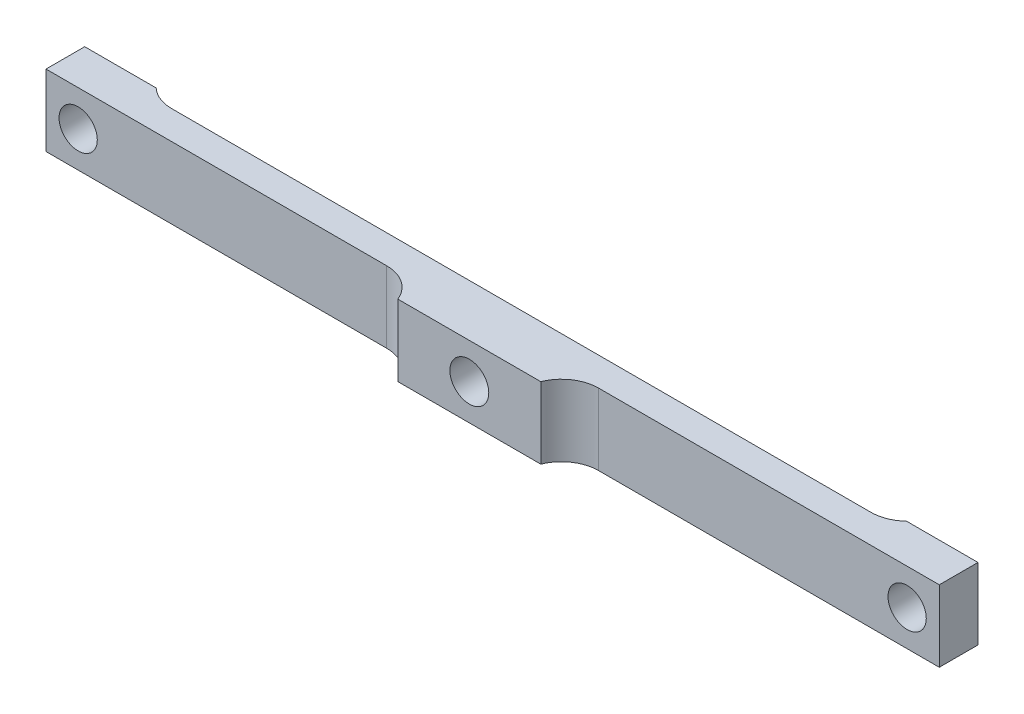
ISO-10303-21;
HEADER;
FILE_DESCRIPTION(('STEP AP214'),'2;1');
FILE_NAME('part.step','',(''),(''),'','','');
FILE_SCHEMA(('AUTOMOTIVE_DESIGN { 1 0 10303 214 1 1 1 1 }'));
ENDSEC;
DATA;
#1=APPLICATION_CONTEXT('core data for automotive mechanical design processes');
#2=APPLICATION_PROTOCOL_DEFINITION('international standard','automotive_design',2000,#1);
#3=PRODUCT_CONTEXT('',#1,'mechanical');
#4=PRODUCT('Part','Part','',(#3));
#5=PRODUCT_RELATED_PRODUCT_CATEGORY('part','',(#4));
#6=PRODUCT_DEFINITION_FORMATION('','',#4);
#7=PRODUCT_DEFINITION_CONTEXT('part definition',#1,'design');
#8=PRODUCT_DEFINITION('design','',#6,#7);
#9=PRODUCT_DEFINITION_SHAPE('','',#8);
#10=(LENGTH_UNIT() NAMED_UNIT(*) SI_UNIT(.MILLI.,.METRE.));
#11=(NAMED_UNIT(*) PLANE_ANGLE_UNIT() SI_UNIT($,.RADIAN.));
#12=(NAMED_UNIT(*) SI_UNIT($,.STERADIAN.) SOLID_ANGLE_UNIT());
#13=UNCERTAINTY_MEASURE_WITH_UNIT(LENGTH_MEASURE(1.E-05),#10,'distance_accuracy_value','');
#14=(GEOMETRIC_REPRESENTATION_CONTEXT(3) GLOBAL_UNCERTAINTY_ASSIGNED_CONTEXT((#13)) GLOBAL_UNIT_ASSIGNED_CONTEXT((#10,
#11,#12)) REPRESENTATION_CONTEXT('',''));
#15=CARTESIAN_POINT('',(0.,0.,0.));
#16=DIRECTION('',(0.,0.,1.));
#17=DIRECTION('',(1.,0.,0.));
#18=AXIS2_PLACEMENT_3D('',#15,#16,#17);
#19=CARTESIAN_POINT('',(39.6875,3.175,5.5118));
#20=DIRECTION('',(0.,0.,-1.));
#21=DIRECTION('',(-1.,0.,0.));
#22=AXIS2_PLACEMENT_3D('',#19,#20,#21);
#23=PLANE('',#22);
#24=DIRECTION('',(0.,-1.,0.));
#25=VECTOR('',#24,1.);
#26=CARTESIAN_POINT('',(-6.35,3.175,5.5118));
#27=LINE('',#26,#25);
#28=CARTESIAN_POINT('',(-6.35,3.175,5.5118));
#29=VERTEX_POINT('',#28);
#30=CARTESIAN_POINT('',(-6.35000000000002,-3.175,5.5118));
#31=VERTEX_POINT('',#30);
#32=EDGE_CURVE('E169',#29,#31,#27,.T.);
#33=ORIENTED_EDGE('',*,*,#32,.T.);
#34=DIRECTION('',(1.,0.,0.));
#35=VECTOR('',#34,1.);
#36=CARTESIAN_POINT('',(-39.6875,-3.175,5.5118));
#37=LINE('',#36,#35);
#38=CARTESIAN_POINT('',(6.35,-3.175,5.5118));
#39=VERTEX_POINT('',#38);
#40=EDGE_CURVE('E173',#31,#39,#37,.T.);
#41=ORIENTED_EDGE('',*,*,#40,.T.);
#42=DIRECTION('',(0.,-1.,0.));
#43=VECTOR('',#42,1.);
#44=CARTESIAN_POINT('',(6.35,3.175,5.5118));
#45=LINE('',#44,#43);
#46=CARTESIAN_POINT('',(6.34999999999999,3.175,5.5118));
#47=VERTEX_POINT('',#46);
#48=EDGE_CURVE('E171',#47,#39,#45,.T.);
#49=ORIENTED_EDGE('',*,*,#48,.F.);
#50=DIRECTION('',(-1.,0.,0.));
#51=VECTOR('',#50,1.);
#52=CARTESIAN_POINT('',(-39.6875,3.175,5.5118));
#53=LINE('',#52,#51);
#54=EDGE_CURVE('E159',#47,#29,#53,.T.);
#55=ORIENTED_EDGE('',*,*,#54,.T.);
#56=EDGE_LOOP('',(#33,#41,#49,#55));
#57=FACE_BOUND('',#56,.T.);
#58=CARTESIAN_POINT('',(0.,0.,5.5118));
#59=DIRECTION('',(0.,0.,1.));
#60=DIRECTION('',(1.,0.,0.));
#61=AXIS2_PLACEMENT_3D('',#58,#59,#60);
#62=CIRCLE('',#61,1.72719999999999);
#63=CARTESIAN_POINT('',(1.72719999999999,0.,5.5118));
#64=VERTEX_POINT('',#63);
#65=EDGE_CURVE('E316',#64,#64,#62,.T.);
#66=ORIENTED_EDGE('',*,*,#65,.F.);
#67=EDGE_LOOP('',(#66));
#68=FACE_BOUND('',#67,.T.);
#69=ADVANCED_FACE('F46',(#57,#68),#23,.F.);
#70=CARTESIAN_POINT('',(-39.6875,3.175,5.5118));
#71=DIRECTION('',(0.,-1.,0.));
#72=DIRECTION('',(0.,0.,-1.));
#73=AXIS2_PLACEMENT_3D('',#70,#71,#72);
#74=PLANE('',#73);
#75=DIRECTION('',(-1.,0.,0.));
#76=VECTOR('',#75,1.);
#77=CARTESIAN_POINT('',(-39.6875,3.175,3.43916));
#78=LINE('',#77,#76);
#79=CARTESIAN_POINT('',(-9.41461710339155,3.175,3.43916));
#80=VERTEX_POINT('',#79);
#81=CARTESIAN_POINT('',(-39.6875,3.175,3.43916));
#82=VERTEX_POINT('',#81);
#83=EDGE_CURVE('E161',#80,#82,#78,.T.);
#84=ORIENTED_EDGE('',*,*,#83,.F.);
#85=CARTESIAN_POINT('',(-9.41461710339155,3.175,6.74116));
#86=DIRECTION('',(0.,-1.,0.));
#87=DIRECTION('',(0.,0.,-1.));
#88=AXIS2_PLACEMENT_3D('',#85,#86,#87);
#89=CIRCLE('',#88,3.302);
#90=EDGE_CURVE('E75',#80,#29,#89,.T.);
#91=ORIENTED_EDGE('',*,*,#90,.T.);
#92=ORIENTED_EDGE('',*,*,#54,.F.);
#93=CARTESIAN_POINT('',(9.41461710339155,3.175,6.74116));
#94=DIRECTION('',(0.,-1.,0.));
#95=DIRECTION('',(0.,0.,-1.));
#96=AXIS2_PLACEMENT_3D('',#93,#94,#95);
#97=CIRCLE('',#96,3.302);
#98=CARTESIAN_POINT('',(9.41461710339155,3.175,3.43916));
#99=VERTEX_POINT('',#98);
#100=EDGE_CURVE('E276',#47,#99,#97,.T.);
#101=ORIENTED_EDGE('',*,*,#100,.T.);
#102=DIRECTION('',(1.,0.,0.));
#103=VECTOR('',#102,1.);
#104=CARTESIAN_POINT('',(39.6875,3.175,3.43916));
#105=LINE('',#104,#103);
#106=CARTESIAN_POINT('',(39.6875,3.175,3.43916));
#107=VERTEX_POINT('',#106);
#108=EDGE_CURVE('E209',#99,#107,#105,.T.);
#109=ORIENTED_EDGE('',*,*,#108,.T.);
#110=DIRECTION('',(0.,0.,-1.));
#111=VECTOR('',#110,1.);
#112=CARTESIAN_POINT('',(39.6875,3.175,5.5118));
#113=LINE('',#112,#111);
#114=CARTESIAN_POINT('',(39.6875,3.175,0.));
#115=VERTEX_POINT('',#114);
#116=EDGE_CURVE('E254',#107,#115,#113,.T.);
#117=ORIENTED_EDGE('',*,*,#116,.T.);
#118=DIRECTION('',(-1.,0.,0.));
#119=VECTOR('',#118,1.);
#120=CARTESIAN_POINT('',(-39.6875,3.175,0.));
#121=LINE('',#120,#119);
#122=CARTESIAN_POINT('',(33.3375,3.175,0.));
#123=VERTEX_POINT('',#122);
#124=EDGE_CURVE('E238',#115,#123,#121,.T.);
#125=ORIENTED_EDGE('',*,*,#124,.T.);
#126=CARTESIAN_POINT('',(31.0726459352974,3.175,-2.40284));
#127=DIRECTION('',(0.,-1.,0.));
#128=DIRECTION('',(0.,0.,-1.));
#129=AXIS2_PLACEMENT_3D('',#126,#127,#128);
#130=CIRCLE('',#129,3.302);
#131=CARTESIAN_POINT('',(31.0726459352974,3.175,0.89916));
#132=VERTEX_POINT('',#131);
#133=EDGE_CURVE('E273',#123,#132,#130,.T.);
#134=ORIENTED_EDGE('',*,*,#133,.T.);
#135=DIRECTION('',(1.,0.,0.));
#136=VECTOR('',#135,1.);
#137=CARTESIAN_POINT('',(-33.3375,3.175,0.89916));
#138=LINE('',#137,#136);
#139=CARTESIAN_POINT('',(-31.0726459352974,3.175,0.89916));
#140=VERTEX_POINT('',#139);
#141=EDGE_CURVE('E219',#140,#132,#138,.T.);
#142=ORIENTED_EDGE('',*,*,#141,.F.);
#143=CARTESIAN_POINT('',(-31.0726459352974,3.175,-2.40284));
#144=DIRECTION('',(0.,-1.,0.));
#145=DIRECTION('',(0.,0.,-1.));
#146=AXIS2_PLACEMENT_3D('',#143,#144,#145);
#147=CIRCLE('',#146,3.302);
#148=CARTESIAN_POINT('',(-33.3375,3.175,0.));
#149=VERTEX_POINT('',#148);
#150=EDGE_CURVE('E55',#140,#149,#147,.T.);
#151=ORIENTED_EDGE('',*,*,#150,.T.);
#152=CARTESIAN_POINT('',(-39.6875,3.175,0.));
#153=VERTEX_POINT('',#152);
#154=EDGE_CURVE('E237',#149,#153,#121,.T.);
#155=ORIENTED_EDGE('',*,*,#154,.T.);
#156=DIRECTION('',(0.,0.,-1.));
#157=VECTOR('',#156,1.);
#158=CARTESIAN_POINT('',(-39.6875,3.175,5.5118));
#159=LINE('',#158,#157);
#160=EDGE_CURVE('E252',#82,#153,#159,.T.);
#161=ORIENTED_EDGE('',*,*,#160,.F.);
#162=EDGE_LOOP('',(#84,#91,#92,#101,#109,#117,#125,#134,#142,#151,#155,#161));
#163=FACE_BOUND('',#162,.T.);
#164=ADVANCED_FACE('F158',(#163),#74,.F.);
#165=CARTESIAN_POINT('',(-39.6875,-3.175,5.5118));
#166=DIRECTION('',(1.,0.,0.));
#167=DIRECTION('',(0.,0.,-1.));
#168=AXIS2_PLACEMENT_3D('',#165,#166,#167);
#169=PLANE('',#168);
#170=DIRECTION('',(0.,-1.,0.));
#171=VECTOR('',#170,1.);
#172=CARTESIAN_POINT('',(-39.6875,3.175,3.43916));
#173=LINE('',#172,#171);
#174=CARTESIAN_POINT('',(-39.6875,-3.175,3.43916));
#175=VERTEX_POINT('',#174);
#176=EDGE_CURVE('E190',#82,#175,#173,.T.);
#177=ORIENTED_EDGE('',*,*,#176,.F.);
#178=ORIENTED_EDGE('',*,*,#160,.T.);
#179=DIRECTION('',(0.,-1.,0.));
#180=VECTOR('',#179,1.);
#181=CARTESIAN_POINT('',(-39.6875,-3.175,0.));
#182=LINE('',#181,#180);
#183=CARTESIAN_POINT('',(-39.6875,-3.175,0.));
#184=VERTEX_POINT('',#183);
#185=EDGE_CURVE('E242',#153,#184,#182,.T.);
#186=ORIENTED_EDGE('',*,*,#185,.T.);
#187=DIRECTION('',(0.,0.,-1.));
#188=VECTOR('',#187,1.);
#189=CARTESIAN_POINT('',(-39.6875,-3.175,5.5118));
#190=LINE('',#189,#188);
#191=EDGE_CURVE('E250',#175,#184,#190,.T.);
#192=ORIENTED_EDGE('',*,*,#191,.F.);
#193=EDGE_LOOP('',(#177,#178,#186,#192));
#194=FACE_BOUND('',#193,.T.);
#195=ADVANCED_FACE('F324',(#194),#169,.F.);
#196=CARTESIAN_POINT('',(-39.6875,-3.175,5.5118));
#197=DIRECTION('',(0.,1.,0.));
#198=DIRECTION('',(0.,0.,1.));
#199=AXIS2_PLACEMENT_3D('',#196,#197,#198);
#200=PLANE('',#199);
#201=ORIENTED_EDGE('',*,*,#40,.F.);
#202=CARTESIAN_POINT('',(-9.41461710339155,-3.175,6.74116));
#203=DIRECTION('',(0.,1.,0.));
#204=DIRECTION('',(0.,0.,1.));
#205=AXIS2_PLACEMENT_3D('',#202,#203,#204);
#206=CIRCLE('',#205,3.302);
#207=CARTESIAN_POINT('',(-9.41461710339155,-3.175,3.43916));
#208=VERTEX_POINT('',#207);
#209=EDGE_CURVE('E64',#31,#208,#206,.T.);
#210=ORIENTED_EDGE('',*,*,#209,.T.);
#211=DIRECTION('',(1.,0.,0.));
#212=VECTOR('',#211,1.);
#213=CARTESIAN_POINT('',(-39.6875,-3.175,3.43916));
#214=LINE('',#213,#212);
#215=EDGE_CURVE('E178',#175,#208,#214,.T.);
#216=ORIENTED_EDGE('',*,*,#215,.F.);
#217=ORIENTED_EDGE('',*,*,#191,.T.);
#218=DIRECTION('',(1.,0.,0.));
#219=VECTOR('',#218,1.);
#220=CARTESIAN_POINT('',(-39.6875,-3.175,0.));
#221=LINE('',#220,#219);
#222=CARTESIAN_POINT('',(-33.3375,-3.175,0.));
#223=VERTEX_POINT('',#222);
#224=EDGE_CURVE('E174',#184,#223,#221,.T.);
#225=ORIENTED_EDGE('',*,*,#224,.T.);
#226=CARTESIAN_POINT('',(-31.0726459352974,-3.175,-2.40284));
#227=DIRECTION('',(0.,1.,0.));
#228=DIRECTION('',(0.,0.,1.));
#229=AXIS2_PLACEMENT_3D('',#226,#227,#228);
#230=CIRCLE('',#229,3.302);
#231=CARTESIAN_POINT('',(-31.0726459352974,-3.175,0.89916));
#232=VERTEX_POINT('',#231);
#233=EDGE_CURVE('E12',#223,#232,#230,.T.);
#234=ORIENTED_EDGE('',*,*,#233,.T.);
#235=DIRECTION('',(-1.,0.,0.));
#236=VECTOR('',#235,1.);
#237=CARTESIAN_POINT('',(-33.3375,-3.175,0.89916));
#238=LINE('',#237,#236);
#239=CARTESIAN_POINT('',(31.0726459352974,-3.175,0.89916));
#240=VERTEX_POINT('',#239);
#241=EDGE_CURVE('E215',#240,#232,#238,.T.);
#242=ORIENTED_EDGE('',*,*,#241,.F.);
#243=CARTESIAN_POINT('',(31.0726459352974,-3.175,-2.40284));
#244=DIRECTION('',(0.,1.,0.));
#245=DIRECTION('',(0.,0.,1.));
#246=AXIS2_PLACEMENT_3D('',#243,#244,#245);
#247=CIRCLE('',#246,3.302);
#248=CARTESIAN_POINT('',(33.3375,-3.175,0.));
#249=VERTEX_POINT('',#248);
#250=EDGE_CURVE('E270',#240,#249,#247,.T.);
#251=ORIENTED_EDGE('',*,*,#250,.T.);
#252=CARTESIAN_POINT('',(39.6875,-3.175,0.));
#253=VERTEX_POINT('',#252);
#254=EDGE_CURVE('E245',#249,#253,#221,.T.);
#255=ORIENTED_EDGE('',*,*,#254,.T.);
#256=DIRECTION('',(0.,0.,-1.));
#257=VECTOR('',#256,1.);
#258=CARTESIAN_POINT('',(39.6875,-3.175,5.5118));
#259=LINE('',#258,#257);
#260=CARTESIAN_POINT('',(39.6875,-3.175,3.43916));
#261=VERTEX_POINT('',#260);
#262=EDGE_CURVE('E233',#261,#253,#259,.T.);
#263=ORIENTED_EDGE('',*,*,#262,.F.);
#264=DIRECTION('',(-1.,0.,0.));
#265=VECTOR('',#264,1.);
#266=CARTESIAN_POINT('',(39.6875,-3.175,3.43916));
#267=LINE('',#266,#265);
#268=CARTESIAN_POINT('',(9.41461710339155,-3.175,3.43916));
#269=VERTEX_POINT('',#268);
#270=EDGE_CURVE('E201',#261,#269,#267,.T.);
#271=ORIENTED_EDGE('',*,*,#270,.T.);
#272=CARTESIAN_POINT('',(9.41461710339155,-3.175,6.74116));
#273=DIRECTION('',(0.,1.,0.));
#274=DIRECTION('',(0.,0.,1.));
#275=AXIS2_PLACEMENT_3D('',#272,#273,#274);
#276=CIRCLE('',#275,3.302);
#277=EDGE_CURVE('E163',#269,#39,#276,.T.);
#278=ORIENTED_EDGE('',*,*,#277,.T.);
#279=EDGE_LOOP('',(#201,#210,#216,#217,#225,#234,#242,#251,#255,#263,#271,#278));
#280=FACE_BOUND('',#279,.T.);
#281=ADVANCED_FACE('F293',(#280),#200,.F.);
#282=CARTESIAN_POINT('',(39.6875,-3.175,5.5118));
#283=DIRECTION('',(-1.,0.,0.));
#284=DIRECTION('',(0.,0.,1.));
#285=AXIS2_PLACEMENT_3D('',#282,#283,#284);
#286=PLANE('',#285);
#287=DIRECTION('',(0.,-1.,0.));
#288=VECTOR('',#287,1.);
#289=CARTESIAN_POINT('',(39.6875,3.175,3.43916));
#290=LINE('',#289,#288);
#291=EDGE_CURVE('E205',#107,#261,#290,.T.);
#292=ORIENTED_EDGE('',*,*,#291,.T.);
#293=ORIENTED_EDGE('',*,*,#262,.T.);
#294=DIRECTION('',(0.,1.,0.));
#295=VECTOR('',#294,1.);
#296=CARTESIAN_POINT('',(39.6875,-3.175,0.));
#297=LINE('',#296,#295);
#298=EDGE_CURVE('E224',#253,#115,#297,.T.);
#299=ORIENTED_EDGE('',*,*,#298,.T.);
#300=ORIENTED_EDGE('',*,*,#116,.F.);
#301=EDGE_LOOP('',(#292,#293,#299,#300));
#302=FACE_BOUND('',#301,.T.);
#303=ADVANCED_FACE('F331',(#302),#286,.F.);
#304=CARTESIAN_POINT('',(39.6875,3.175,0.));
#305=DIRECTION('',(0.,0.,-1.));
#306=DIRECTION('',(-1.,0.,0.));
#307=AXIS2_PLACEMENT_3D('',#304,#305,#306);
#308=PLANE('',#307);
#309=CARTESIAN_POINT('',(36.83,0.,0.));
#310=DIRECTION('',(0.,0.,1.));
#311=DIRECTION('',(1.,0.,0.));
#312=AXIS2_PLACEMENT_3D('',#309,#310,#311);
#313=CIRCLE('',#312,1.7);
#314=CARTESIAN_POINT('',(38.53,0.,0.));
#315=VERTEX_POINT('',#314);
#316=EDGE_CURVE('E197',#315,#315,#313,.T.);
#317=ORIENTED_EDGE('',*,*,#316,.T.);
#318=EDGE_LOOP('',(#317));
#319=FACE_BOUND('',#318,.T.);
#320=DIRECTION('',(0.,-1.,0.));
#321=VECTOR('',#320,1.);
#322=CARTESIAN_POINT('',(33.3375,3.175,0.));
#323=LINE('',#322,#321);
#324=EDGE_CURVE('E214',#123,#249,#323,.T.);
#325=ORIENTED_EDGE('',*,*,#324,.F.);
#326=ORIENTED_EDGE('',*,*,#124,.F.);
#327=ORIENTED_EDGE('',*,*,#298,.F.);
#328=ORIENTED_EDGE('',*,*,#254,.F.);
#329=EDGE_LOOP('',(#325,#326,#327,#328));
#330=FACE_BOUND('',#329,.T.);
#331=ADVANCED_FACE('F305',(#319,#330),#308,.T.);
#332=CARTESIAN_POINT('',(-36.83,0.,0.));
#333=DIRECTION('',(0.,0.,1.));
#334=DIRECTION('',(1.,0.,0.));
#335=AXIS2_PLACEMENT_3D('',#332,#333,#334);
#336=CIRCLE('',#335,1.7);
#337=CARTESIAN_POINT('',(-35.13,0.,0.));
#338=VERTEX_POINT('',#337);
#339=EDGE_CURVE('E179',#338,#338,#336,.T.);
#340=ORIENTED_EDGE('',*,*,#339,.T.);
#341=EDGE_LOOP('',(#340));
#342=FACE_BOUND('',#341,.T.);
#343=DIRECTION('',(0.,1.,0.));
#344=VECTOR('',#343,1.);
#345=CARTESIAN_POINT('',(-33.3375,3.175,0.));
#346=LINE('',#345,#344);
#347=EDGE_CURVE('E220',#223,#149,#346,.T.);
#348=ORIENTED_EDGE('',*,*,#347,.F.);
#349=ORIENTED_EDGE('',*,*,#224,.F.);
#350=ORIENTED_EDGE('',*,*,#185,.F.);
#351=ORIENTED_EDGE('',*,*,#154,.F.);
#352=EDGE_LOOP('',(#348,#349,#350,#351));
#353=FACE_BOUND('',#352,.T.);
#354=ADVANCED_FACE('F289',(#342,#353),#308,.T.);
#355=CARTESIAN_POINT('',(33.3375,-3.175,0.89916));
#356=DIRECTION('',(0.,0.,1.));
#357=DIRECTION('',(1.,0.,0.));
#358=AXIS2_PLACEMENT_3D('',#355,#356,#357);
#359=PLANE('',#358);
#360=CARTESIAN_POINT('',(0.,0.,0.89916));
#361=DIRECTION('',(0.,0.,1.));
#362=DIRECTION('',(1.,0.,0.));
#363=AXIS2_PLACEMENT_3D('',#360,#361,#362);
#364=CIRCLE('',#363,1.72719999999999);
#365=CARTESIAN_POINT('',(1.72719999999999,0.,0.89916));
#366=VERTEX_POINT('',#365);
#367=EDGE_CURVE('E310',#366,#366,#364,.T.);
#368=ORIENTED_EDGE('',*,*,#367,.T.);
#369=EDGE_LOOP('',(#368));
#370=FACE_BOUND('',#369,.T.);
#371=ORIENTED_EDGE('',*,*,#141,.T.);
#372=DIRECTION('',(0.,1.,0.));
#373=VECTOR('',#372,1.);
#374=CARTESIAN_POINT('',(31.0726459352974,-3.175,0.89916));
#375=LINE('',#374,#373);
#376=EDGE_CURVE('E261',#132,#240,#375,.F.);
#377=ORIENTED_EDGE('',*,*,#376,.T.);
#378=ORIENTED_EDGE('',*,*,#241,.T.);
#379=DIRECTION('',(0.,-1.,0.));
#380=VECTOR('',#379,1.);
#381=CARTESIAN_POINT('',(-31.0726459352974,-3.175,0.89916));
#382=LINE('',#381,#380);
#383=EDGE_CURVE('E257',#232,#140,#382,.F.);
#384=ORIENTED_EDGE('',*,*,#383,.T.);
#385=EDGE_LOOP('',(#371,#377,#378,#384));
#386=FACE_BOUND('',#385,.T.);
#387=ADVANCED_FACE('F295',(#370,#386),#359,.F.);
#388=CARTESIAN_POINT('',(33.3375,-3.175,3.43916));
#389=DIRECTION('',(0.,0.,1.));
#390=DIRECTION('',(1.,0.,0.));
#391=AXIS2_PLACEMENT_3D('',#388,#389,#390);
#392=PLANE('',#391);
#393=CARTESIAN_POINT('',(36.83,0.,3.43916));
#394=DIRECTION('',(0.,0.,1.));
#395=DIRECTION('',(1.,0.,0.));
#396=AXIS2_PLACEMENT_3D('',#393,#394,#395);
#397=CIRCLE('',#396,1.69999999999999);
#398=CARTESIAN_POINT('',(38.53,0.,3.43916));
#399=VERTEX_POINT('',#398);
#400=EDGE_CURVE('E193',#399,#399,#397,.T.);
#401=ORIENTED_EDGE('',*,*,#400,.F.);
#402=EDGE_LOOP('',(#401));
#403=FACE_BOUND('',#402,.T.);
#404=ORIENTED_EDGE('',*,*,#108,.F.);
#405=DIRECTION('',(0.,1.,0.));
#406=VECTOR('',#405,1.);
#407=CARTESIAN_POINT('',(9.41461710339155,-3.175,3.43916));
#408=LINE('',#407,#406);
#409=EDGE_CURVE('E265',#99,#269,#408,.F.);
#410=ORIENTED_EDGE('',*,*,#409,.T.);
#411=ORIENTED_EDGE('',*,*,#270,.F.);
#412=ORIENTED_EDGE('',*,*,#291,.F.);
#413=EDGE_LOOP('',(#404,#410,#411,#412));
#414=FACE_BOUND('',#413,.T.);
#415=ADVANCED_FACE('F347',(#403,#414),#392,.T.);
#416=CARTESIAN_POINT('',(36.83,0.,3.43916));
#417=DIRECTION('',(0.,0.,1.));
#418=DIRECTION('',(1.,0.,0.));
#419=AXIS2_PLACEMENT_3D('',#416,#417,#418);
#420=CYLINDRICAL_SURFACE('',#419,1.69999999999999);
#421=ORIENTED_EDGE('',*,*,#316,.F.);
#422=EDGE_LOOP('',(#421));
#423=FACE_BOUND('',#422,.T.);
#424=ORIENTED_EDGE('',*,*,#400,.T.);
#425=EDGE_LOOP('',(#424));
#426=FACE_BOUND('',#425,.T.);
#427=ADVANCED_FACE('F362',(#423,#426),#420,.F.);
#428=CARTESIAN_POINT('',(33.3375,-3.175,3.43916));
#429=DIRECTION('',(0.,0.,1.));
#430=DIRECTION('',(1.,0.,0.));
#431=AXIS2_PLACEMENT_3D('',#428,#429,#430);
#432=PLANE('',#431);
#433=CARTESIAN_POINT('',(-36.83,0.,3.43916));
#434=DIRECTION('',(0.,0.,1.));
#435=DIRECTION('',(1.,0.,0.));
#436=AXIS2_PLACEMENT_3D('',#433,#434,#435);
#437=CIRCLE('',#436,1.69999999999999);
#438=CARTESIAN_POINT('',(-35.13,0.,3.43916));
#439=VERTEX_POINT('',#438);
#440=EDGE_CURVE('E187',#439,#439,#437,.T.);
#441=ORIENTED_EDGE('',*,*,#440,.F.);
#442=EDGE_LOOP('',(#441));
#443=FACE_BOUND('',#442,.T.);
#444=ORIENTED_EDGE('',*,*,#215,.T.);
#445=DIRECTION('',(0.,1.,0.));
#446=VECTOR('',#445,1.);
#447=CARTESIAN_POINT('',(-9.41461710339155,3.175,3.43916));
#448=LINE('',#447,#446);
#449=EDGE_CURVE('E268',#208,#80,#448,.T.);
#450=ORIENTED_EDGE('',*,*,#449,.T.);
#451=ORIENTED_EDGE('',*,*,#83,.T.);
#452=ORIENTED_EDGE('',*,*,#176,.T.);
#453=EDGE_LOOP('',(#444,#450,#451,#452));
#454=FACE_BOUND('',#453,.T.);
#455=ADVANCED_FACE('F321',(#443,#454),#432,.T.);
#456=CARTESIAN_POINT('',(-36.83,0.,3.43916));
#457=DIRECTION('',(0.,0.,1.));
#458=DIRECTION('',(1.,0.,0.));
#459=AXIS2_PLACEMENT_3D('',#456,#457,#458);
#460=CYLINDRICAL_SURFACE('',#459,1.69999999999999);
#461=ORIENTED_EDGE('',*,*,#339,.F.);
#462=EDGE_LOOP('',(#461));
#463=FACE_BOUND('',#462,.T.);
#464=ORIENTED_EDGE('',*,*,#440,.T.);
#465=EDGE_LOOP('',(#464));
#466=FACE_BOUND('',#465,.T.);
#467=ADVANCED_FACE('F352',(#463,#466),#460,.F.);
#468=CARTESIAN_POINT('',(0.,0.,5.5118));
#469=DIRECTION('',(0.,0.,1.));
#470=DIRECTION('',(1.,0.,0.));
#471=AXIS2_PLACEMENT_3D('',#468,#469,#470);
#472=CYLINDRICAL_SURFACE('',#471,1.72719999999999);
#473=ORIENTED_EDGE('',*,*,#65,.T.);
#474=EDGE_LOOP('',(#473));
#475=FACE_BOUND('',#474,.T.);
#476=ORIENTED_EDGE('',*,*,#367,.F.);
#477=EDGE_LOOP('',(#476));
#478=FACE_BOUND('',#477,.T.);
#479=ADVANCED_FACE('F354',(#475,#478),#472,.F.);
#480=CARTESIAN_POINT('',(31.0726459352974,3.175,-2.40284));
#481=DIRECTION('',(0.,1.,0.));
#482=DIRECTION('',(0.,0.,1.));
#483=AXIS2_PLACEMENT_3D('',#480,#481,#482);
#484=CYLINDRICAL_SURFACE('',#483,3.302);
#485=ORIENTED_EDGE('',*,*,#133,.F.);
#486=ORIENTED_EDGE('',*,*,#324,.T.);
#487=ORIENTED_EDGE('',*,*,#250,.F.);
#488=ORIENTED_EDGE('',*,*,#376,.F.);
#489=EDGE_LOOP('',(#485,#486,#487,#488));
#490=FACE_BOUND('',#489,.T.);
#491=ADVANCED_FACE('F299',(#490),#484,.F.);
#492=CARTESIAN_POINT('',(9.41461710339155,3.175,6.74116));
#493=DIRECTION('',(0.,-1.,0.));
#494=DIRECTION('',(0.,0.,-1.));
#495=AXIS2_PLACEMENT_3D('',#492,#493,#494);
#496=CYLINDRICAL_SURFACE('',#495,3.302);
#497=ORIENTED_EDGE('',*,*,#277,.F.);
#498=ORIENTED_EDGE('',*,*,#409,.F.);
#499=ORIENTED_EDGE('',*,*,#100,.F.);
#500=ORIENTED_EDGE('',*,*,#48,.T.);
#501=EDGE_LOOP('',(#497,#498,#499,#500));
#502=FACE_BOUND('',#501,.T.);
#503=ADVANCED_FACE('F380',(#502),#496,.F.);
#504=CARTESIAN_POINT('',(-9.41461710339155,3.175,6.74116));
#505=DIRECTION('',(0.,-1.,0.));
#506=DIRECTION('',(0.,0.,-1.));
#507=AXIS2_PLACEMENT_3D('',#504,#505,#506);
#508=CYLINDRICAL_SURFACE('',#507,3.302);
#509=ORIENTED_EDGE('',*,*,#209,.F.);
#510=ORIENTED_EDGE('',*,*,#32,.F.);
#511=ORIENTED_EDGE('',*,*,#90,.F.);
#512=ORIENTED_EDGE('',*,*,#449,.F.);
#513=EDGE_LOOP('',(#509,#510,#511,#512));
#514=FACE_BOUND('',#513,.T.);
#515=ADVANCED_FACE('F176',(#514),#508,.F.);
#516=CARTESIAN_POINT('',(-31.0726459352974,3.175,-2.40284));
#517=DIRECTION('',(0.,-1.,0.));
#518=DIRECTION('',(0.,0.,-1.));
#519=AXIS2_PLACEMENT_3D('',#516,#517,#518);
#520=CYLINDRICAL_SURFACE('',#519,3.302);
#521=ORIENTED_EDGE('',*,*,#233,.F.);
#522=ORIENTED_EDGE('',*,*,#347,.T.);
#523=ORIENTED_EDGE('',*,*,#150,.F.);
#524=ORIENTED_EDGE('',*,*,#383,.F.);
#525=EDGE_LOOP('',(#521,#522,#523,#524));
#526=FACE_BOUND('',#525,.T.);
#527=ADVANCED_FACE('F48',(#526),#520,.F.);
#528=CLOSED_SHELL('',(#69,#164,#195,#281,#303,#331,#354,#387,#415,#427,#455,#467,#479,#491,#503,
#515,#527));
#529=MANIFOLD_SOLID_BREP('B2',#528);
#530=ADVANCED_BREP_SHAPE_REPRESENTATION('',(#18,#529),#14);
#531=SHAPE_DEFINITION_REPRESENTATION(#9,#530);
ENDSEC;
END-ISO-10303-21;
